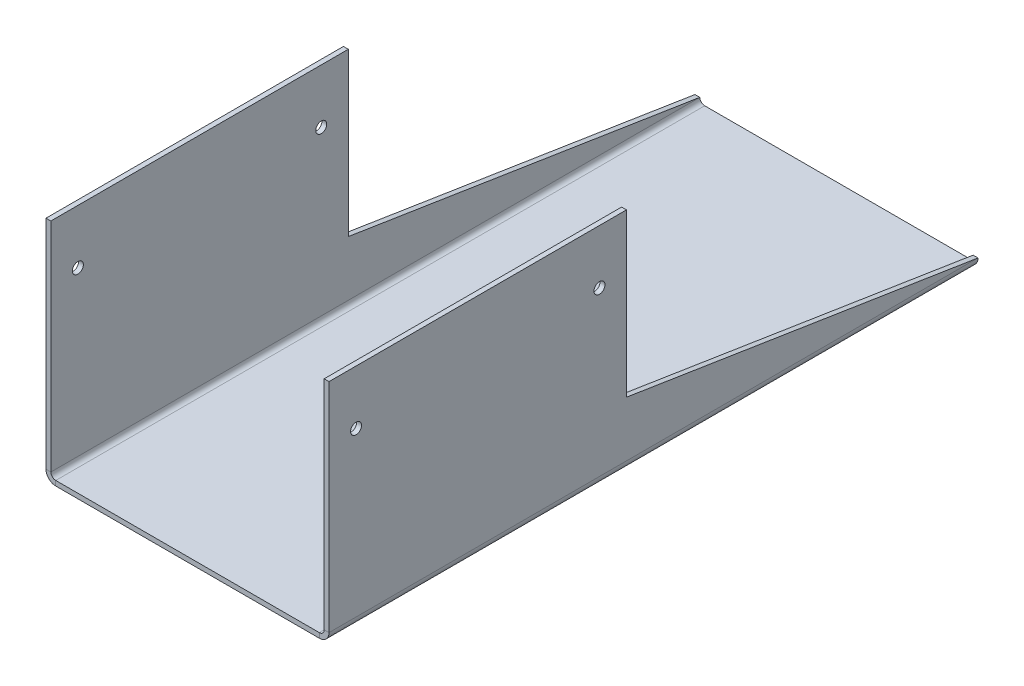
ISO-10303-21;
HEADER;
FILE_DESCRIPTION(('STEP AP214'),'2;1');
FILE_NAME('part.step','',(''),(''),'','','');
FILE_SCHEMA(('AUTOMOTIVE_DESIGN { 1 0 10303 214 1 1 1 1 }'));
ENDSEC;
DATA;
#1=APPLICATION_CONTEXT('core data for automotive mechanical design processes');
#2=APPLICATION_PROTOCOL_DEFINITION('international standard','automotive_design',2000,#1);
#3=PRODUCT_CONTEXT('',#1,'mechanical');
#4=PRODUCT('Part','Part','',(#3));
#5=PRODUCT_RELATED_PRODUCT_CATEGORY('part','',(#4));
#6=PRODUCT_DEFINITION_FORMATION('','',#4);
#7=PRODUCT_DEFINITION_CONTEXT('part definition',#1,'design');
#8=PRODUCT_DEFINITION('design','',#6,#7);
#9=PRODUCT_DEFINITION_SHAPE('','',#8);
#10=(LENGTH_UNIT() NAMED_UNIT(*) SI_UNIT(.MILLI.,.METRE.));
#11=(NAMED_UNIT(*) PLANE_ANGLE_UNIT() SI_UNIT($,.RADIAN.));
#12=(NAMED_UNIT(*) SI_UNIT($,.STERADIAN.) SOLID_ANGLE_UNIT());
#13=UNCERTAINTY_MEASURE_WITH_UNIT(LENGTH_MEASURE(1.E-05),#10,'distance_accuracy_value','');
#14=(GEOMETRIC_REPRESENTATION_CONTEXT(3) GLOBAL_UNCERTAINTY_ASSIGNED_CONTEXT((#13)) GLOBAL_UNIT_ASSIGNED_CONTEXT((#10,
#11,#12)) REPRESENTATION_CONTEXT('',''));
#15=CARTESIAN_POINT('',(0.,0.,0.));
#16=DIRECTION('',(0.,0.,1.));
#17=DIRECTION('',(1.,0.,0.));
#18=AXIS2_PLACEMENT_3D('',#15,#16,#17);
#19=CARTESIAN_POINT('',(132.9436,0.,304.8));
#20=DIRECTION('',(-1.,0.,0.));
#21=DIRECTION('',(0.,0.,1.));
#22=AXIS2_PLACEMENT_3D('',#19,#20,#21);
#23=PLANE('',#22);
#24=CARTESIAN_POINT('',(132.9436,81.28,292.1));
#25=DIRECTION('',(-1.,0.,0.));
#26=DIRECTION('',(0.,-1.,0.));
#27=AXIS2_PLACEMENT_3D('',#24,#25,#26);
#28=CIRCLE('',#27,2.57968750000001);
#29=CARTESIAN_POINT('',(132.9436,78.7003125,292.1));
#30=VERTEX_POINT('',#29);
#31=EDGE_CURVE('E665',#30,#30,#28,.T.);
#32=ORIENTED_EDGE('',*,*,#31,.T.);
#33=EDGE_LOOP('',(#32));
#34=FACE_BOUND('',#33,.T.);
#35=CARTESIAN_POINT('',(132.9436,81.28,177.8));
#36=DIRECTION('',(-1.,0.,0.));
#37=DIRECTION('',(0.,-1.,0.));
#38=AXIS2_PLACEMENT_3D('',#35,#36,#37);
#39=CIRCLE('',#38,2.57968750000001);
#40=CARTESIAN_POINT('',(132.9436,78.7003125,177.8));
#41=VERTEX_POINT('',#40);
#42=EDGE_CURVE('E651',#41,#41,#39,.T.);
#43=ORIENTED_EDGE('',*,*,#42,.T.);
#44=EDGE_LOOP('',(#43));
#45=FACE_BOUND('',#44,.T.);
#46=DIRECTION('',(0.,0.155025939660865,0.987910399799631));
#47=VECTOR('',#46,1.);
#48=CARTESIAN_POINT('',(132.9436,51.1427706835695,296.774519061963));
#49=LINE('',#48,#47);
#50=CARTESIAN_POINT('',(132.9436,4.572,0.));
#51=VERTEX_POINT('',#50);
#52=CARTESIAN_POINT('',(132.9436,30.48,165.1));
#53=VERTEX_POINT('',#52);
#54=EDGE_CURVE('E289',#51,#53,#49,.T.);
#55=ORIENTED_EDGE('',*,*,#54,.T.);
#56=DIRECTION('',(0.,1.,0.));
#57=VECTOR('',#56,1.);
#58=CARTESIAN_POINT('',(132.9436,0.,165.1));
#59=LINE('',#58,#57);
#60=CARTESIAN_POINT('',(132.9436,106.68,165.1));
#61=VERTEX_POINT('',#60);
#62=EDGE_CURVE('E337',#53,#61,#59,.T.);
#63=ORIENTED_EDGE('',*,*,#62,.T.);
#64=DIRECTION('',(0.,0.,-1.));
#65=VECTOR('',#64,1.);
#66=CARTESIAN_POINT('',(132.9436,106.68,304.8));
#67=LINE('',#66,#65);
#68=CARTESIAN_POINT('',(132.9436,106.68,304.8));
#69=VERTEX_POINT('',#68);
#70=EDGE_CURVE('E214',#69,#61,#67,.T.);
#71=ORIENTED_EDGE('',*,*,#70,.F.);
#72=DIRECTION('',(0.,1.,0.));
#73=VECTOR('',#72,1.);
#74=CARTESIAN_POINT('',(132.9436,0.,304.8));
#75=LINE('',#74,#73);
#76=CARTESIAN_POINT('',(132.9436,4.572,304.8));
#77=VERTEX_POINT('',#76);
#78=EDGE_CURVE('E105',#77,#69,#75,.T.);
#79=ORIENTED_EDGE('',*,*,#78,.F.);
#80=DIRECTION('',(0.,0.,-1.));
#81=VECTOR('',#80,1.);
#82=CARTESIAN_POINT('',(132.9436,4.572,304.8));
#83=LINE('',#82,#81);
#84=EDGE_CURVE('E170',#77,#51,#83,.T.);
#85=ORIENTED_EDGE('',*,*,#84,.T.);
#86=EDGE_LOOP('',(#55,#63,#71,#79,#85));
#87=FACE_BOUND('',#86,.T.);
#88=ADVANCED_FACE('F50',(#34,#45,#87),#23,.F.);
#89=CARTESIAN_POINT('',(130.6576,106.68,304.8));
#90=DIRECTION('',(0.,1.,0.));
#91=DIRECTION('',(0.,0.,1.));
#92=AXIS2_PLACEMENT_3D('',#89,#90,#91);
#93=PLANE('',#92);
#94=ORIENTED_EDGE('',*,*,#70,.T.);
#95=DIRECTION('',(-1.,0.,0.));
#96=VECTOR('',#95,1.);
#97=CARTESIAN_POINT('',(130.6576,106.68,165.1));
#98=LINE('',#97,#96);
#99=CARTESIAN_POINT('',(130.6576,106.68,165.1));
#100=VERTEX_POINT('',#99);
#101=EDGE_CURVE('E334',#100,#61,#98,.F.);
#102=ORIENTED_EDGE('',*,*,#101,.F.);
#103=DIRECTION('',(0.,0.,-1.));
#104=VECTOR('',#103,1.);
#105=CARTESIAN_POINT('',(130.6576,106.68,304.8));
#106=LINE('',#105,#104);
#107=CARTESIAN_POINT('',(130.6576,106.68,304.8));
#108=VERTEX_POINT('',#107);
#109=EDGE_CURVE('E211',#108,#100,#106,.T.);
#110=ORIENTED_EDGE('',*,*,#109,.F.);
#111=DIRECTION('',(1.,0.,0.));
#112=VECTOR('',#111,1.);
#113=CARTESIAN_POINT('',(130.6576,106.68,304.8));
#114=LINE('',#113,#112);
#115=EDGE_CURVE('E322',#108,#69,#114,.T.);
#116=ORIENTED_EDGE('',*,*,#115,.T.);
#117=EDGE_LOOP('',(#94,#102,#110,#116));
#118=FACE_BOUND('',#117,.T.);
#119=ADVANCED_FACE('F332',(#118),#93,.T.);
#120=CARTESIAN_POINT('',(130.6576,0.,304.8));
#121=DIRECTION('',(-1.,0.,0.));
#122=DIRECTION('',(0.,0.,1.));
#123=AXIS2_PLACEMENT_3D('',#120,#121,#122);
#124=PLANE('',#123);
#125=CARTESIAN_POINT('',(130.6576,81.28,292.1));
#126=DIRECTION('',(-1.,0.,0.));
#127=DIRECTION('',(0.,0.,1.));
#128=AXIS2_PLACEMENT_3D('',#125,#126,#127);
#129=CIRCLE('',#128,2.57968750000001);
#130=CARTESIAN_POINT('',(130.6576,81.28,294.6796875));
#131=VERTEX_POINT('',#130);
#132=EDGE_CURVE('E645',#131,#131,#129,.T.);
#133=ORIENTED_EDGE('',*,*,#132,.F.);
#134=EDGE_LOOP('',(#133));
#135=FACE_BOUND('',#134,.T.);
#136=CARTESIAN_POINT('',(130.6576,81.28,177.8));
#137=DIRECTION('',(-1.,0.,0.));
#138=DIRECTION('',(0.,0.,1.));
#139=AXIS2_PLACEMENT_3D('',#136,#137,#138);
#140=CIRCLE('',#139,2.57968750000001);
#141=CARTESIAN_POINT('',(130.6576,81.28,180.3796875));
#142=VERTEX_POINT('',#141);
#143=EDGE_CURVE('E309',#142,#142,#140,.T.);
#144=ORIENTED_EDGE('',*,*,#143,.F.);
#145=EDGE_LOOP('',(#144));
#146=FACE_BOUND('',#145,.T.);
#147=DIRECTION('',(0.,1.,0.));
#148=VECTOR('',#147,1.);
#149=CARTESIAN_POINT('',(130.6576,-1.01770443923973E-13,165.1));
#150=LINE('',#149,#148);
#151=CARTESIAN_POINT('',(130.6576,30.48,165.1));
#152=VERTEX_POINT('',#151);
#153=EDGE_CURVE('E308',#152,#100,#150,.T.);
#154=ORIENTED_EDGE('',*,*,#153,.F.);
#155=DIRECTION('',(0.,0.155025939660865,0.987910399799631));
#156=VECTOR('',#155,1.);
#157=CARTESIAN_POINT('',(130.6576,51.1427706835695,296.774519061963));
#158=LINE('',#157,#156);
#159=CARTESIAN_POINT('',(130.6576,4.572,0.));
#160=VERTEX_POINT('',#159);
#161=EDGE_CURVE('E300',#160,#152,#158,.T.);
#162=ORIENTED_EDGE('',*,*,#161,.F.);
#163=DIRECTION('',(0.,0.,-1.));
#164=VECTOR('',#163,1.);
#165=CARTESIAN_POINT('',(130.6576,4.572,304.8));
#166=LINE('',#165,#164);
#167=CARTESIAN_POINT('',(130.6576,4.572,304.8));
#168=VERTEX_POINT('',#167);
#169=EDGE_CURVE('E208',#168,#160,#166,.T.);
#170=ORIENTED_EDGE('',*,*,#169,.F.);
#171=DIRECTION('',(0.,1.,0.));
#172=VECTOR('',#171,1.);
#173=CARTESIAN_POINT('',(130.6576,0.,304.8));
#174=LINE('',#173,#172);
#175=EDGE_CURVE('E324',#168,#108,#174,.T.);
#176=ORIENTED_EDGE('',*,*,#175,.T.);
#177=ORIENTED_EDGE('',*,*,#109,.T.);
#178=EDGE_LOOP('',(#154,#162,#170,#176,#177));
#179=FACE_BOUND('',#178,.T.);
#180=ADVANCED_FACE('F306',(#135,#146,#179),#124,.T.);
#181=CARTESIAN_POINT('',(2.286,106.68,304.8));
#182=DIRECTION('',(1.,0.,0.));
#183=DIRECTION('',(0.,1.,0.));
#184=AXIS2_PLACEMENT_3D('',#181,#182,#183);
#185=PLANE('',#184);
#186=CARTESIAN_POINT('',(2.28600000000001,81.28,292.1));
#187=DIRECTION('',(1.,0.,0.));
#188=DIRECTION('',(0.,1.,0.));
#189=AXIS2_PLACEMENT_3D('',#186,#187,#188);
#190=CIRCLE('',#189,2.57968750000001);
#191=CARTESIAN_POINT('',(2.28600000000001,83.8596875,292.1));
#192=VERTEX_POINT('',#191);
#193=EDGE_CURVE('E662',#192,#192,#190,.T.);
#194=ORIENTED_EDGE('',*,*,#193,.F.);
#195=EDGE_LOOP('',(#194));
#196=FACE_BOUND('',#195,.T.);
#197=CARTESIAN_POINT('',(2.28600000000001,81.28,177.8));
#198=DIRECTION('',(1.,0.,0.));
#199=DIRECTION('',(0.,1.,0.));
#200=AXIS2_PLACEMENT_3D('',#197,#198,#199);
#201=CIRCLE('',#200,2.57968750000001);
#202=CARTESIAN_POINT('',(2.28600000000001,83.8596875,177.8));
#203=VERTEX_POINT('',#202);
#204=EDGE_CURVE('E648',#203,#203,#201,.T.);
#205=ORIENTED_EDGE('',*,*,#204,.F.);
#206=EDGE_LOOP('',(#205));
#207=FACE_BOUND('',#206,.T.);
#208=DIRECTION('',(0.,-0.155025939660865,-0.987910399799631));
#209=VECTOR('',#208,1.);
#210=CARTESIAN_POINT('',(2.286,53.7066156006874,313.112746474969));
#211=LINE('',#210,#209);
#212=CARTESIAN_POINT('',(2.286,30.48,165.1));
#213=VERTEX_POINT('',#212);
#214=CARTESIAN_POINT('',(2.286,4.572,0.));
#215=VERTEX_POINT('',#214);
#216=EDGE_CURVE('E251',#213,#215,#211,.T.);
#217=ORIENTED_EDGE('',*,*,#216,.F.);
#218=DIRECTION('',(0.,-1.,0.));
#219=VECTOR('',#218,1.);
#220=CARTESIAN_POINT('',(2.286,106.68,165.1));
#221=LINE('',#220,#219);
#222=CARTESIAN_POINT('',(2.286,106.68,165.1));
#223=VERTEX_POINT('',#222);
#224=EDGE_CURVE('E282',#223,#213,#221,.T.);
#225=ORIENTED_EDGE('',*,*,#224,.F.);
#226=DIRECTION('',(0.,0.,-1.));
#227=VECTOR('',#226,1.);
#228=CARTESIAN_POINT('',(2.286,106.68,304.8));
#229=LINE('',#228,#227);
#230=CARTESIAN_POINT('',(2.286,106.68,304.8));
#231=VERTEX_POINT('',#230);
#232=EDGE_CURVE('E196',#231,#223,#229,.T.);
#233=ORIENTED_EDGE('',*,*,#232,.F.);
#234=DIRECTION('',(0.,-1.,0.));
#235=VECTOR('',#234,1.);
#236=CARTESIAN_POINT('',(2.286,106.68,304.8));
#237=LINE('',#236,#235);
#238=CARTESIAN_POINT('',(2.286,4.572,304.8));
#239=VERTEX_POINT('',#238);
#240=EDGE_CURVE('E253',#231,#239,#237,.T.);
#241=ORIENTED_EDGE('',*,*,#240,.T.);
#242=DIRECTION('',(0.,0.,-1.));
#243=VECTOR('',#242,1.);
#244=CARTESIAN_POINT('',(2.286,4.572,304.8));
#245=LINE('',#244,#243);
#246=EDGE_CURVE('E199',#239,#215,#245,.T.);
#247=ORIENTED_EDGE('',*,*,#246,.T.);
#248=EDGE_LOOP('',(#217,#225,#233,#241,#247));
#249=FACE_BOUND('',#248,.T.);
#250=ADVANCED_FACE('F248',(#196,#207,#249),#185,.T.);
#251=CARTESIAN_POINT('',(0.,106.68,304.8));
#252=DIRECTION('',(0.,1.,0.));
#253=DIRECTION('',(0.,0.,1.));
#254=AXIS2_PLACEMENT_3D('',#251,#252,#253);
#255=PLANE('',#254);
#256=ORIENTED_EDGE('',*,*,#232,.T.);
#257=DIRECTION('',(1.,0.,0.));
#258=VECTOR('',#257,1.);
#259=CARTESIAN_POINT('',(2.286,106.68,165.1));
#260=LINE('',#259,#258);
#261=CARTESIAN_POINT('',(0.,106.68,165.1));
#262=VERTEX_POINT('',#261);
#263=EDGE_CURVE('E178',#223,#262,#260,.F.);
#264=ORIENTED_EDGE('',*,*,#263,.T.);
#265=DIRECTION('',(0.,0.,-1.));
#266=VECTOR('',#265,1.);
#267=CARTESIAN_POINT('',(0.,106.68,304.8));
#268=LINE('',#267,#266);
#269=CARTESIAN_POINT('',(0.,106.68,304.8));
#270=VERTEX_POINT('',#269);
#271=EDGE_CURVE('E193',#270,#262,#268,.T.);
#272=ORIENTED_EDGE('',*,*,#271,.F.);
#273=DIRECTION('',(1.,0.,0.));
#274=VECTOR('',#273,1.);
#275=CARTESIAN_POINT('',(0.,106.68,304.8));
#276=LINE('',#275,#274);
#277=EDGE_CURVE('E255',#270,#231,#276,.T.);
#278=ORIENTED_EDGE('',*,*,#277,.T.);
#279=EDGE_LOOP('',(#256,#264,#272,#278));
#280=FACE_BOUND('',#279,.T.);
#281=ADVANCED_FACE('F347',(#280),#255,.T.);
#282=CARTESIAN_POINT('',(0.,106.68,304.8));
#283=DIRECTION('',(1.,0.,0.));
#284=DIRECTION('',(0.,1.,0.));
#285=AXIS2_PLACEMENT_3D('',#282,#283,#284);
#286=PLANE('',#285);
#287=CARTESIAN_POINT('',(0.,81.28,292.1));
#288=DIRECTION('',(-1.,0.,0.));
#289=DIRECTION('',(0.,-1.,0.));
#290=AXIS2_PLACEMENT_3D('',#287,#288,#289);
#291=CIRCLE('',#290,2.57968750000001);
#292=CARTESIAN_POINT('',(0.,78.7003125,292.1));
#293=VERTEX_POINT('',#292);
#294=EDGE_CURVE('E666',#293,#293,#291,.T.);
#295=ORIENTED_EDGE('',*,*,#294,.F.);
#296=EDGE_LOOP('',(#295));
#297=FACE_BOUND('',#296,.T.);
#298=CARTESIAN_POINT('',(0.,81.28,177.8));
#299=DIRECTION('',(-1.,0.,0.));
#300=DIRECTION('',(0.,-1.,0.));
#301=AXIS2_PLACEMENT_3D('',#298,#299,#300);
#302=CIRCLE('',#301,2.57968750000001);
#303=CARTESIAN_POINT('',(0.,78.7003125,177.8));
#304=VERTEX_POINT('',#303);
#305=EDGE_CURVE('E656',#304,#304,#302,.T.);
#306=ORIENTED_EDGE('',*,*,#305,.F.);
#307=EDGE_LOOP('',(#306));
#308=FACE_BOUND('',#307,.T.);
#309=DIRECTION('',(0.,1.,0.));
#310=VECTOR('',#309,1.);
#311=CARTESIAN_POINT('',(0.,106.68,165.1));
#312=LINE('',#311,#310);
#313=CARTESIAN_POINT('',(0.,30.48,165.1));
#314=VERTEX_POINT('',#313);
#315=EDGE_CURVE('E341',#262,#314,#312,.F.);
#316=ORIENTED_EDGE('',*,*,#315,.T.);
#317=DIRECTION('',(0.,-0.155025939660865,-0.987910399799631));
#318=VECTOR('',#317,1.);
#319=CARTESIAN_POINT('',(0.,53.7066156006874,313.112746474969));
#320=LINE('',#319,#318);
#321=CARTESIAN_POINT('',(0.,4.57199999999999,1.11022302462516E-13));
#322=VERTEX_POINT('',#321);
#323=EDGE_CURVE('E270',#314,#322,#320,.T.);
#324=ORIENTED_EDGE('',*,*,#323,.T.);
#325=DIRECTION('',(0.,0.,-1.));
#326=VECTOR('',#325,1.);
#327=CARTESIAN_POINT('',(0.,4.57199999999999,304.8));
#328=LINE('',#327,#326);
#329=CARTESIAN_POINT('',(0.,4.57199999999999,304.8));
#330=VERTEX_POINT('',#329);
#331=EDGE_CURVE('E162',#330,#322,#328,.T.);
#332=ORIENTED_EDGE('',*,*,#331,.F.);
#333=DIRECTION('',(0.,-1.,0.));
#334=VECTOR('',#333,1.);
#335=CARTESIAN_POINT('',(0.,106.68,304.8));
#336=LINE('',#335,#334);
#337=EDGE_CURVE('E153',#270,#330,#336,.T.);
#338=ORIENTED_EDGE('',*,*,#337,.F.);
#339=ORIENTED_EDGE('',*,*,#271,.T.);
#340=EDGE_LOOP('',(#316,#324,#332,#338,#339));
#341=FACE_BOUND('',#340,.T.);
#342=ADVANCED_FACE('F269',(#297,#308,#341),#286,.F.);
#343=CARTESIAN_POINT('',(0.,4.57199999999999,304.8));
#344=DIRECTION('',(0.,0.,1.));
#345=DIRECTION('',(1.,0.,0.));
#346=AXIS2_PLACEMENT_3D('',#343,#344,#345);
#347=PLANE('',#346);
#348=DIRECTION('',(1.,0.,0.));
#349=VECTOR('',#348,1.);
#350=CARTESIAN_POINT('',(0.,4.57199999999999,304.8));
#351=LINE('',#350,#349);
#352=EDGE_CURVE('E13',#330,#239,#351,.T.);
#353=ORIENTED_EDGE('',*,*,#352,.F.);
#354=CARTESIAN_POINT('',(4.572,4.572,304.8));
#355=DIRECTION('',(0.,0.,-1.));
#356=DIRECTION('',(-1.,0.,0.));
#357=AXIS2_PLACEMENT_3D('',#354,#355,#356);
#358=CIRCLE('',#357,4.572);
#359=CARTESIAN_POINT('',(4.572,0.,304.8));
#360=VERTEX_POINT('',#359);
#361=EDGE_CURVE('E148',#330,#360,#358,.F.);
#362=ORIENTED_EDGE('',*,*,#361,.T.);
#363=DIRECTION('',(0.,-1.,0.));
#364=VECTOR('',#363,1.);
#365=CARTESIAN_POINT('',(4.572,2.286,304.8));
#366=LINE('',#365,#364);
#367=CARTESIAN_POINT('',(4.572,2.286,304.8));
#368=VERTEX_POINT('',#367);
#369=EDGE_CURVE('E58',#368,#360,#366,.T.);
#370=ORIENTED_EDGE('',*,*,#369,.F.);
#371=CARTESIAN_POINT('',(4.572,4.572,304.8));
#372=DIRECTION('',(0.,0.,1.));
#373=DIRECTION('',(1.,0.,0.));
#374=AXIS2_PLACEMENT_3D('',#371,#372,#373);
#375=CIRCLE('',#374,2.286);
#376=EDGE_CURVE('E234',#239,#368,#375,.T.);
#377=ORIENTED_EDGE('',*,*,#376,.F.);
#378=EDGE_LOOP('',(#353,#362,#370,#377));
#379=FACE_BOUND('',#378,.T.);
#380=ADVANCED_FACE('F52',(#379),#347,.T.);
#381=CARTESIAN_POINT('',(4.572,2.286,304.8));
#382=DIRECTION('',(0.,0.,1.));
#383=DIRECTION('',(1.,0.,0.));
#384=AXIS2_PLACEMENT_3D('',#381,#382,#383);
#385=PLANE('',#384);
#386=ORIENTED_EDGE('',*,*,#337,.T.);
#387=ORIENTED_EDGE('',*,*,#352,.T.);
#388=ORIENTED_EDGE('',*,*,#240,.F.);
#389=ORIENTED_EDGE('',*,*,#277,.F.);
#390=EDGE_LOOP('',(#386,#387,#388,#389));
#391=FACE_BOUND('',#390,.T.);
#392=ADVANCED_FACE('F266',(#391),#385,.T.);
#393=CARTESIAN_POINT('',(4.572,0.,0.));
#394=DIRECTION('',(0.,0.,-1.));
#395=DIRECTION('',(-1.,0.,0.));
#396=AXIS2_PLACEMENT_3D('',#393,#394,#395);
#397=PLANE('',#396);
#398=DIRECTION('',(0.,1.,0.));
#399=VECTOR('',#398,1.);
#400=CARTESIAN_POINT('',(4.572,0.,0.));
#401=LINE('',#400,#399);
#402=CARTESIAN_POINT('',(4.572,0.,0.));
#403=VERTEX_POINT('',#402);
#404=CARTESIAN_POINT('',(4.572,2.286,0.));
#405=VERTEX_POINT('',#404);
#406=EDGE_CURVE('E146',#403,#405,#401,.T.);
#407=ORIENTED_EDGE('',*,*,#406,.F.);
#408=CARTESIAN_POINT('',(4.572,4.572,0.));
#409=DIRECTION('',(0.,0.,-1.));
#410=DIRECTION('',(-1.,0.,0.));
#411=AXIS2_PLACEMENT_3D('',#408,#409,#410);
#412=CIRCLE('',#411,4.572);
#413=EDGE_CURVE('E160',#322,#403,#412,.F.);
#414=ORIENTED_EDGE('',*,*,#413,.F.);
#415=DIRECTION('',(-1.,0.,0.));
#416=VECTOR('',#415,1.);
#417=CARTESIAN_POINT('',(2.286,4.572,0.));
#418=LINE('',#417,#416);
#419=EDGE_CURVE('E224',#215,#322,#418,.T.);
#420=ORIENTED_EDGE('',*,*,#419,.F.);
#421=CARTESIAN_POINT('',(4.572,4.572,0.));
#422=DIRECTION('',(0.,0.,1.));
#423=DIRECTION('',(1.,0.,0.));
#424=AXIS2_PLACEMENT_3D('',#421,#422,#423);
#425=CIRCLE('',#424,2.286);
#426=EDGE_CURVE('E180',#215,#405,#425,.T.);
#427=ORIENTED_EDGE('',*,*,#426,.T.);
#428=EDGE_LOOP('',(#407,#414,#420,#427));
#429=FACE_BOUND('',#428,.T.);
#430=ADVANCED_FACE('F240',(#429),#397,.T.);
#431=CARTESIAN_POINT('',(2.286,4.572,0.));
#432=DIRECTION('',(0.,0.,-1.));
#433=DIRECTION('',(-1.,0.,0.));
#434=AXIS2_PLACEMENT_3D('',#431,#432,#433);
#435=PLANE('',#434);
#436=DIRECTION('',(1.,0.,0.));
#437=VECTOR('',#436,1.);
#438=CARTESIAN_POINT('',(0.,0.,0.));
#439=LINE('',#438,#437);
#440=CARTESIAN_POINT('',(128.3716,0.,0.));
#441=VERTEX_POINT('',#440);
#442=EDGE_CURVE('E184',#403,#441,#439,.T.);
#443=ORIENTED_EDGE('',*,*,#442,.F.);
#444=ORIENTED_EDGE('',*,*,#406,.T.);
#445=DIRECTION('',(1.,0.,0.));
#446=VECTOR('',#445,1.);
#447=CARTESIAN_POINT('',(0.,2.286,0.));
#448=LINE('',#447,#446);
#449=CARTESIAN_POINT('',(128.3716,2.286,0.));
#450=VERTEX_POINT('',#449);
#451=EDGE_CURVE('E177',#405,#450,#448,.T.);
#452=ORIENTED_EDGE('',*,*,#451,.T.);
#453=DIRECTION('',(0.,-1.,0.));
#454=VECTOR('',#453,1.);
#455=CARTESIAN_POINT('',(128.3716,2.286,0.));
#456=LINE('',#455,#454);
#457=EDGE_CURVE('E99',#450,#441,#456,.T.);
#458=ORIENTED_EDGE('',*,*,#457,.T.);
#459=EDGE_LOOP('',(#443,#444,#452,#458));
#460=FACE_BOUND('',#459,.T.);
#461=ADVANCED_FACE('F227',(#460),#435,.T.);
#462=CARTESIAN_POINT('',(128.3716,0.,304.8));
#463=DIRECTION('',(0.,0.,1.));
#464=DIRECTION('',(1.,0.,0.));
#465=AXIS2_PLACEMENT_3D('',#462,#463,#464);
#466=PLANE('',#465);
#467=DIRECTION('',(0.,1.,0.));
#468=VECTOR('',#467,1.);
#469=CARTESIAN_POINT('',(128.3716,0.,304.8));
#470=LINE('',#469,#468);
#471=CARTESIAN_POINT('',(128.3716,0.,304.8));
#472=VERTEX_POINT('',#471);
#473=CARTESIAN_POINT('',(128.3716,2.286,304.8));
#474=VERTEX_POINT('',#473);
#475=EDGE_CURVE('E222',#472,#474,#470,.T.);
#476=ORIENTED_EDGE('',*,*,#475,.F.);
#477=CARTESIAN_POINT('',(128.3716,4.572,304.8));
#478=DIRECTION('',(0.,0.,-1.));
#479=DIRECTION('',(-1.,0.,0.));
#480=AXIS2_PLACEMENT_3D('',#477,#478,#479);
#481=CIRCLE('',#480,4.572);
#482=EDGE_CURVE('E168',#472,#77,#481,.F.);
#483=ORIENTED_EDGE('',*,*,#482,.T.);
#484=DIRECTION('',(1.,0.,0.));
#485=VECTOR('',#484,1.);
#486=CARTESIAN_POINT('',(130.6576,4.572,304.8));
#487=LINE('',#486,#485);
#488=EDGE_CURVE('E74',#168,#77,#487,.T.);
#489=ORIENTED_EDGE('',*,*,#488,.F.);
#490=CARTESIAN_POINT('',(128.3716,4.572,304.8));
#491=DIRECTION('',(0.,0.,1.));
#492=DIRECTION('',(1.,0.,0.));
#493=AXIS2_PLACEMENT_3D('',#490,#491,#492);
#494=CIRCLE('',#493,2.286);
#495=EDGE_CURVE('E257',#474,#168,#494,.T.);
#496=ORIENTED_EDGE('',*,*,#495,.F.);
#497=EDGE_LOOP('',(#476,#483,#489,#496));
#498=FACE_BOUND('',#497,.T.);
#499=ADVANCED_FACE('F373',(#498),#466,.T.);
#500=CARTESIAN_POINT('',(130.6576,4.572,304.8));
#501=DIRECTION('',(0.,0.,1.));
#502=DIRECTION('',(1.,0.,0.));
#503=AXIS2_PLACEMENT_3D('',#500,#501,#502);
#504=PLANE('',#503);
#505=DIRECTION('',(1.,0.,0.));
#506=VECTOR('',#505,1.);
#507=CARTESIAN_POINT('',(0.,0.,304.8));
#508=LINE('',#507,#506);
#509=EDGE_CURVE('E138',#360,#472,#508,.T.);
#510=ORIENTED_EDGE('',*,*,#509,.T.);
#511=ORIENTED_EDGE('',*,*,#475,.T.);
#512=DIRECTION('',(1.,0.,0.));
#513=VECTOR('',#512,1.);
#514=CARTESIAN_POINT('',(0.,2.286,304.8));
#515=LINE('',#514,#513);
#516=EDGE_CURVE('E141',#368,#474,#515,.T.);
#517=ORIENTED_EDGE('',*,*,#516,.F.);
#518=ORIENTED_EDGE('',*,*,#369,.T.);
#519=EDGE_LOOP('',(#510,#511,#517,#518));
#520=FACE_BOUND('',#519,.T.);
#521=ADVANCED_FACE('F136',(#520),#504,.T.);
#522=CARTESIAN_POINT('',(132.9436,4.572,0.));
#523=DIRECTION('',(0.,0.,-1.));
#524=DIRECTION('',(-1.,0.,0.));
#525=AXIS2_PLACEMENT_3D('',#522,#523,#524);
#526=PLANE('',#525);
#527=DIRECTION('',(-1.,0.,0.));
#528=VECTOR('',#527,1.);
#529=CARTESIAN_POINT('',(132.9436,4.572,0.));
#530=LINE('',#529,#528);
#531=EDGE_CURVE('E218',#51,#160,#530,.T.);
#532=ORIENTED_EDGE('',*,*,#531,.F.);
#533=CARTESIAN_POINT('',(128.3716,4.572,0.));
#534=DIRECTION('',(0.,0.,-1.));
#535=DIRECTION('',(-1.,0.,0.));
#536=AXIS2_PLACEMENT_3D('',#533,#534,#535);
#537=CIRCLE('',#536,4.572);
#538=EDGE_CURVE('E186',#441,#51,#537,.F.);
#539=ORIENTED_EDGE('',*,*,#538,.F.);
#540=ORIENTED_EDGE('',*,*,#457,.F.);
#541=CARTESIAN_POINT('',(128.3716,4.572,0.));
#542=DIRECTION('',(0.,0.,1.));
#543=DIRECTION('',(1.,0.,0.));
#544=AXIS2_PLACEMENT_3D('',#541,#542,#543);
#545=CIRCLE('',#544,2.286);
#546=EDGE_CURVE('E174',#450,#160,#545,.T.);
#547=ORIENTED_EDGE('',*,*,#546,.T.);
#548=EDGE_LOOP('',(#532,#539,#540,#547));
#549=FACE_BOUND('',#548,.T.);
#550=ADVANCED_FACE('F315',(#549),#526,.T.);
#551=CARTESIAN_POINT('',(128.3716,4.572,304.8));
#552=DIRECTION('',(0.,0.,-1.));
#553=DIRECTION('',(-1.,0.,0.));
#554=AXIS2_PLACEMENT_3D('',#551,#552,#553);
#555=CYLINDRICAL_SURFACE('',#554,2.286);
#556=ORIENTED_EDGE('',*,*,#546,.F.);
#557=DIRECTION('',(0.,0.,-1.));
#558=VECTOR('',#557,1.);
#559=CARTESIAN_POINT('',(128.3716,2.286,304.8));
#560=LINE('',#559,#558);
#561=EDGE_CURVE('E205',#474,#450,#560,.T.);
#562=ORIENTED_EDGE('',*,*,#561,.F.);
#563=ORIENTED_EDGE('',*,*,#495,.T.);
#564=ORIENTED_EDGE('',*,*,#169,.T.);
#565=EDGE_LOOP('',(#556,#562,#563,#564));
#566=FACE_BOUND('',#565,.T.);
#567=ADVANCED_FACE('F313',(#566),#555,.F.);
#568=CARTESIAN_POINT('',(0.,2.286,304.8));
#569=DIRECTION('',(0.,1.,0.));
#570=DIRECTION('',(0.,0.,1.));
#571=AXIS2_PLACEMENT_3D('',#568,#569,#570);
#572=PLANE('',#571);
#573=ORIENTED_EDGE('',*,*,#451,.F.);
#574=DIRECTION('',(0.,0.,-1.));
#575=VECTOR('',#574,1.);
#576=CARTESIAN_POINT('',(4.572,2.286,304.8));
#577=LINE('',#576,#575);
#578=EDGE_CURVE('E202',#368,#405,#577,.T.);
#579=ORIENTED_EDGE('',*,*,#578,.F.);
#580=ORIENTED_EDGE('',*,*,#516,.T.);
#581=ORIENTED_EDGE('',*,*,#561,.T.);
#582=EDGE_LOOP('',(#573,#579,#580,#581));
#583=FACE_BOUND('',#582,.T.);
#584=ADVANCED_FACE('F236',(#583),#572,.T.);
#585=CARTESIAN_POINT('',(4.572,4.572,304.8));
#586=DIRECTION('',(0.,0.,-1.));
#587=DIRECTION('',(-1.,0.,0.));
#588=AXIS2_PLACEMENT_3D('',#585,#586,#587);
#589=CYLINDRICAL_SURFACE('',#588,2.286);
#590=ORIENTED_EDGE('',*,*,#426,.F.);
#591=ORIENTED_EDGE('',*,*,#246,.F.);
#592=ORIENTED_EDGE('',*,*,#376,.T.);
#593=ORIENTED_EDGE('',*,*,#578,.T.);
#594=EDGE_LOOP('',(#590,#591,#592,#593));
#595=FACE_BOUND('',#594,.T.);
#596=ADVANCED_FACE('F232',(#595),#589,.F.);
#597=CARTESIAN_POINT('',(4.572,4.572,304.8));
#598=DIRECTION('',(0.,0.,-1.));
#599=DIRECTION('',(-1.,0.,0.));
#600=AXIS2_PLACEMENT_3D('',#597,#598,#599);
#601=CYLINDRICAL_SURFACE('',#600,4.572);
#602=ORIENTED_EDGE('',*,*,#413,.T.);
#603=DIRECTION('',(0.,0.,-1.));
#604=VECTOR('',#603,1.);
#605=CARTESIAN_POINT('',(4.572,0.,304.8));
#606=LINE('',#605,#604);
#607=EDGE_CURVE('E157',#360,#403,#606,.T.);
#608=ORIENTED_EDGE('',*,*,#607,.F.);
#609=ORIENTED_EDGE('',*,*,#361,.F.);
#610=ORIENTED_EDGE('',*,*,#331,.T.);
#611=EDGE_LOOP('',(#602,#608,#609,#610));
#612=FACE_BOUND('',#611,.T.);
#613=ADVANCED_FACE('F158',(#612),#601,.T.);
#614=CARTESIAN_POINT('',(0.,0.,304.8));
#615=DIRECTION('',(0.,1.,0.));
#616=DIRECTION('',(0.,0.,1.));
#617=AXIS2_PLACEMENT_3D('',#614,#615,#616);
#618=PLANE('',#617);
#619=ORIENTED_EDGE('',*,*,#442,.T.);
#620=DIRECTION('',(0.,0.,-1.));
#621=VECTOR('',#620,1.);
#622=CARTESIAN_POINT('',(128.3716,0.,304.8));
#623=LINE('',#622,#621);
#624=EDGE_CURVE('E163',#472,#441,#623,.T.);
#625=ORIENTED_EDGE('',*,*,#624,.F.);
#626=ORIENTED_EDGE('',*,*,#509,.F.);
#627=ORIENTED_EDGE('',*,*,#607,.T.);
#628=EDGE_LOOP('',(#619,#625,#626,#627));
#629=FACE_BOUND('',#628,.T.);
#630=ADVANCED_FACE('F165',(#629),#618,.F.);
#631=CARTESIAN_POINT('',(128.3716,4.572,304.8));
#632=DIRECTION('',(0.,0.,-1.));
#633=DIRECTION('',(-1.,0.,0.));
#634=AXIS2_PLACEMENT_3D('',#631,#632,#633);
#635=CYLINDRICAL_SURFACE('',#634,4.572);
#636=ORIENTED_EDGE('',*,*,#538,.T.);
#637=ORIENTED_EDGE('',*,*,#84,.F.);
#638=ORIENTED_EDGE('',*,*,#482,.F.);
#639=ORIENTED_EDGE('',*,*,#624,.T.);
#640=EDGE_LOOP('',(#636,#637,#638,#639));
#641=FACE_BOUND('',#640,.T.);
#642=ADVANCED_FACE('F318',(#641),#635,.T.);
#643=CARTESIAN_POINT('',(128.3716,4.572,304.8));
#644=DIRECTION('',(0.,0.,1.));
#645=DIRECTION('',(1.,0.,0.));
#646=AXIS2_PLACEMENT_3D('',#643,#644,#645);
#647=PLANE('',#646);
#648=ORIENTED_EDGE('',*,*,#78,.T.);
#649=ORIENTED_EDGE('',*,*,#115,.F.);
#650=ORIENTED_EDGE('',*,*,#175,.F.);
#651=ORIENTED_EDGE('',*,*,#488,.T.);
#652=EDGE_LOOP('',(#648,#649,#650,#651));
#653=FACE_BOUND('',#652,.T.);
#654=ADVANCED_FACE('F330',(#653),#647,.T.);
#655=CARTESIAN_POINT('',(2.286,106.68,165.1));
#656=DIRECTION('',(0.,0.,1.));
#657=DIRECTION('',(0.,-1.,0.));
#658=AXIS2_PLACEMENT_3D('',#655,#656,#657);
#659=PLANE('',#658);
#660=ORIENTED_EDGE('',*,*,#263,.F.);
#661=ORIENTED_EDGE('',*,*,#224,.T.);
#662=DIRECTION('',(1.,0.,0.));
#663=VECTOR('',#662,1.);
#664=CARTESIAN_POINT('',(2.286,30.48,165.1));
#665=LINE('',#664,#663);
#666=EDGE_CURVE('E327',#213,#314,#665,.F.);
#667=ORIENTED_EDGE('',*,*,#666,.T.);
#668=ORIENTED_EDGE('',*,*,#315,.F.);
#669=EDGE_LOOP('',(#660,#661,#667,#668));
#670=FACE_BOUND('',#669,.T.);
#671=ADVANCED_FACE('F346',(#670),#659,.F.);
#672=CARTESIAN_POINT('',(2.286,53.7066156006874,313.112746474969));
#673=DIRECTION('',(0.,-0.987910399799631,0.155025939660865));
#674=DIRECTION('',(0.,-0.155025939660865,-0.987910399799631));
#675=AXIS2_PLACEMENT_3D('',#672,#673,#674);
#676=PLANE('',#675);
#677=ORIENTED_EDGE('',*,*,#216,.T.);
#678=ORIENTED_EDGE('',*,*,#419,.T.);
#679=ORIENTED_EDGE('',*,*,#323,.F.);
#680=ORIENTED_EDGE('',*,*,#666,.F.);
#681=EDGE_LOOP('',(#677,#678,#679,#680));
#682=FACE_BOUND('',#681,.T.);
#683=ADVANCED_FACE('F460',(#682),#676,.F.);
#684=CARTESIAN_POINT('',(130.6576,51.1427706835695,296.774519061963));
#685=DIRECTION('',(0.,-0.987910399799631,0.155025939660865));
#686=DIRECTION('',(0.,0.155025939660865,0.987910399799631));
#687=AXIS2_PLACEMENT_3D('',#684,#685,#686);
#688=PLANE('',#687);
#689=ORIENTED_EDGE('',*,*,#531,.T.);
#690=ORIENTED_EDGE('',*,*,#161,.T.);
#691=DIRECTION('',(-1.,0.,0.));
#692=VECTOR('',#691,1.);
#693=CARTESIAN_POINT('',(130.6576,30.48,165.1));
#694=LINE('',#693,#692);
#695=EDGE_CURVE('E65',#152,#53,#694,.F.);
#696=ORIENTED_EDGE('',*,*,#695,.T.);
#697=ORIENTED_EDGE('',*,*,#54,.F.);
#698=EDGE_LOOP('',(#689,#690,#696,#697));
#699=FACE_BOUND('',#698,.T.);
#700=ADVANCED_FACE('F299',(#699),#688,.F.);
#701=CARTESIAN_POINT('',(130.6576,-1.01770443923973E-13,165.1));
#702=DIRECTION('',(0.,0.,1.));
#703=DIRECTION('',(0.,1.,0.));
#704=AXIS2_PLACEMENT_3D('',#701,#702,#703);
#705=PLANE('',#704);
#706=ORIENTED_EDGE('',*,*,#153,.T.);
#707=ORIENTED_EDGE('',*,*,#101,.T.);
#708=ORIENTED_EDGE('',*,*,#62,.F.);
#709=ORIENTED_EDGE('',*,*,#695,.F.);
#710=EDGE_LOOP('',(#706,#707,#708,#709));
#711=FACE_BOUND('',#710,.T.);
#712=ADVANCED_FACE('F407',(#711),#705,.F.);
#713=CARTESIAN_POINT('',(132.9436,81.28,177.8));
#714=DIRECTION('',(-1.,0.,0.));
#715=DIRECTION('',(0.,-1.,0.));
#716=AXIS2_PLACEMENT_3D('',#713,#714,#715);
#717=CYLINDRICAL_SURFACE('',#716,2.57968750000001);
#718=ORIENTED_EDGE('',*,*,#204,.T.);
#719=EDGE_LOOP('',(#718));
#720=FACE_BOUND('',#719,.T.);
#721=ORIENTED_EDGE('',*,*,#305,.T.);
#722=EDGE_LOOP('',(#721));
#723=FACE_BOUND('',#722,.T.);
#724=ADVANCED_FACE('F401',(#720,#723),#717,.F.);
#725=ORIENTED_EDGE('',*,*,#143,.T.);
#726=EDGE_LOOP('',(#725));
#727=FACE_BOUND('',#726,.T.);
#728=ORIENTED_EDGE('',*,*,#42,.F.);
#729=EDGE_LOOP('',(#728));
#730=FACE_BOUND('',#729,.T.);
#731=ADVANCED_FACE('F406',(#727,#730),#717,.F.);
#732=CARTESIAN_POINT('',(132.9436,81.28,292.1));
#733=DIRECTION('',(-1.,0.,0.));
#734=DIRECTION('',(0.,-1.,0.));
#735=AXIS2_PLACEMENT_3D('',#732,#733,#734);
#736=CYLINDRICAL_SURFACE('',#735,2.57968750000001);
#737=ORIENTED_EDGE('',*,*,#193,.T.);
#738=EDGE_LOOP('',(#737));
#739=FACE_BOUND('',#738,.T.);
#740=ORIENTED_EDGE('',*,*,#294,.T.);
#741=EDGE_LOOP('',(#740));
#742=FACE_BOUND('',#741,.T.);
#743=ADVANCED_FACE('F420',(#739,#742),#736,.F.);
#744=ORIENTED_EDGE('',*,*,#132,.T.);
#745=EDGE_LOOP('',(#744));
#746=FACE_BOUND('',#745,.T.);
#747=ORIENTED_EDGE('',*,*,#31,.F.);
#748=EDGE_LOOP('',(#747));
#749=FACE_BOUND('',#748,.T.);
#750=ADVANCED_FACE('F430',(#746,#749),#736,.F.);
#751=CLOSED_SHELL('',(#88,#119,#180,#250,#281,#342,#380,#392,#430,#461,#499,#521,#550,#567,#584,
#596,#613,#630,#642,#654,#671,#683,#700,#712,#724,#731,#743,#750));
#752=MANIFOLD_SOLID_BREP('B2',#751);
#753=ADVANCED_BREP_SHAPE_REPRESENTATION('',(#18,#752),#14);
#754=SHAPE_DEFINITION_REPRESENTATION(#9,#753);
ENDSEC;
END-ISO-10303-21;
